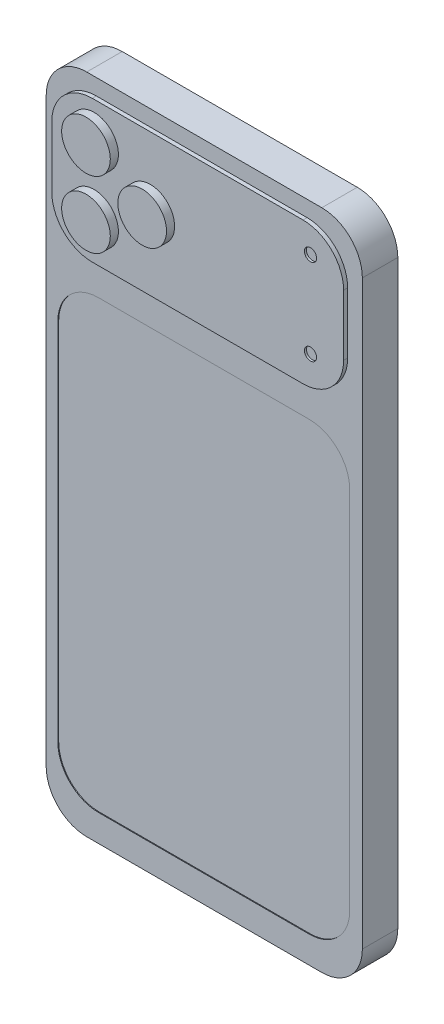
ISO-10303-21;
HEADER;
FILE_DESCRIPTION(('STEP AP214'),'2;1');
FILE_NAME('part.step','',(''),(''),'','','');
FILE_SCHEMA(('AUTOMOTIVE_DESIGN { 1 0 10303 214 1 1 1 1 }'));
ENDSEC;
DATA;
#1=APPLICATION_CONTEXT('core data for automotive mechanical design processes');
#2=APPLICATION_PROTOCOL_DEFINITION('international standard','automotive_design',2000,#1);
#3=PRODUCT_CONTEXT('',#1,'mechanical');
#4=PRODUCT('Part','Part','',(#3));
#5=PRODUCT_RELATED_PRODUCT_CATEGORY('part','',(#4));
#6=PRODUCT_DEFINITION_FORMATION('','',#4);
#7=PRODUCT_DEFINITION_CONTEXT('part definition',#1,'design');
#8=PRODUCT_DEFINITION('design','',#6,#7);
#9=PRODUCT_DEFINITION_SHAPE('','',#8);
#10=(LENGTH_UNIT() NAMED_UNIT(*) SI_UNIT(.MILLI.,.METRE.));
#11=(NAMED_UNIT(*) PLANE_ANGLE_UNIT() SI_UNIT($,.RADIAN.));
#12=(NAMED_UNIT(*) SI_UNIT($,.STERADIAN.) SOLID_ANGLE_UNIT());
#13=UNCERTAINTY_MEASURE_WITH_UNIT(LENGTH_MEASURE(1.E-05),#10,'distance_accuracy_value','');
#14=(GEOMETRIC_REPRESENTATION_CONTEXT(3) GLOBAL_UNCERTAINTY_ASSIGNED_CONTEXT((#13)) GLOBAL_UNIT_ASSIGNED_CONTEXT((#10,
#11,#12)) REPRESENTATION_CONTEXT('',''));
#15=CARTESIAN_POINT('',(0.,0.,0.));
#16=DIRECTION('',(0.,0.,1.));
#17=DIRECTION('',(1.,0.,0.));
#18=AXIS2_PLACEMENT_3D('',#15,#16,#17);
#19=CARTESIAN_POINT('',(68.,10.,8.75));
#20=DIRECTION('',(0.,0.,1.));
#21=DIRECTION('',(1.,0.,0.));
#22=AXIS2_PLACEMENT_3D('',#19,#20,#21);
#23=PLANE('',#22);
#24=CARTESIAN_POINT('',(12.8879630427938,106.636129808757,8.75));
#25=DIRECTION('',(0.,0.,1.));
#26=DIRECTION('',(1.,0.,0.));
#27=AXIS2_PLACEMENT_3D('',#24,#25,#26);
#28=CIRCLE('',#27,10.);
#29=CARTESIAN_POINT('',(12.8879630427938,116.636129808757,8.75));
#30=VERTEX_POINT('',#29);
#31=CARTESIAN_POINT('',(2.88796304279382,106.636129808757,8.75));
#32=VERTEX_POINT('',#31);
#33=EDGE_CURVE('E60',#30,#32,#28,.T.);
#34=ORIENTED_EDGE('',*,*,#33,.F.);
#35=DIRECTION('',(1.,0.,0.));
#36=VECTOR('',#35,1.);
#37=CARTESIAN_POINT('',(12.8879630427938,116.636129808757,8.75));
#38=LINE('',#37,#36);
#39=CARTESIAN_POINT('',(64.8879630427938,116.636129808757,8.75));
#40=VERTEX_POINT('',#39);
#41=EDGE_CURVE('E230',#30,#40,#38,.T.);
#42=ORIENTED_EDGE('',*,*,#41,.T.);
#43=CARTESIAN_POINT('',(64.8879630427938,106.636129808757,8.75));
#44=DIRECTION('',(0.,0.,-1.));
#45=DIRECTION('',(-1.,0.,0.));
#46=AXIS2_PLACEMENT_3D('',#43,#44,#45);
#47=CIRCLE('',#46,10.);
#48=CARTESIAN_POINT('',(74.8879630427938,106.636129808757,8.75));
#49=VERTEX_POINT('',#48);
#50=EDGE_CURVE('E234',#40,#49,#47,.T.);
#51=ORIENTED_EDGE('',*,*,#50,.T.);
#52=DIRECTION('',(0.,-1.,0.));
#53=VECTOR('',#52,1.);
#54=CARTESIAN_POINT('',(74.8879630427938,106.636129808757,8.75));
#55=LINE('',#54,#53);
#56=CARTESIAN_POINT('',(74.8879630427938,16.6361298087572,8.75));
#57=VERTEX_POINT('',#56);
#58=EDGE_CURVE('E272',#49,#57,#55,.T.);
#59=ORIENTED_EDGE('',*,*,#58,.T.);
#60=CARTESIAN_POINT('',(64.8879630427938,16.6361298087572,8.75));
#61=DIRECTION('',(0.,0.,1.));
#62=DIRECTION('',(1.,0.,0.));
#63=AXIS2_PLACEMENT_3D('',#60,#61,#62);
#64=CIRCLE('',#63,10.);
#65=CARTESIAN_POINT('',(64.8879630427938,6.63612980875716,8.75));
#66=VERTEX_POINT('',#65);
#67=EDGE_CURVE('E268',#66,#57,#64,.T.);
#68=ORIENTED_EDGE('',*,*,#67,.F.);
#69=DIRECTION('',(1.,0.,0.));
#70=VECTOR('',#69,1.);
#71=CARTESIAN_POINT('',(12.8879630427938,6.63612980875716,8.75));
#72=LINE('',#71,#70);
#73=CARTESIAN_POINT('',(12.8879630427938,6.63612980875716,8.75));
#74=VERTEX_POINT('',#73);
#75=EDGE_CURVE('E264',#74,#66,#72,.T.);
#76=ORIENTED_EDGE('',*,*,#75,.F.);
#77=CARTESIAN_POINT('',(12.8879630427938,16.6361298087572,8.75));
#78=DIRECTION('',(0.,0.,1.));
#79=DIRECTION('',(1.,0.,0.));
#80=AXIS2_PLACEMENT_3D('',#77,#78,#79);
#81=CIRCLE('',#80,10.);
#82=CARTESIAN_POINT('',(2.88796304279383,16.6361298087572,8.75));
#83=VERTEX_POINT('',#82);
#84=EDGE_CURVE('E260',#83,#74,#81,.T.);
#85=ORIENTED_EDGE('',*,*,#84,.F.);
#86=DIRECTION('',(0.,-1.,0.));
#87=VECTOR('',#86,1.);
#88=CARTESIAN_POINT('',(2.88796304279382,106.636129808757,8.75));
#89=LINE('',#88,#87);
#90=EDGE_CURVE('E257',#32,#83,#89,.T.);
#91=ORIENTED_EDGE('',*,*,#90,.F.);
#92=EDGE_LOOP('',(#34,#42,#51,#59,#68,#76,#85,#91));
#93=FACE_BOUND('',#92,.T.);
#94=CARTESIAN_POINT('',(68.,10.,8.75));
#95=DIRECTION('',(0.,0.,1.));
#96=DIRECTION('',(1.,0.,0.));
#97=AXIS2_PLACEMENT_3D('',#94,#95,#96);
#98=CIRCLE('',#97,10.);
#99=CARTESIAN_POINT('',(67.9999999999999,0.,8.75));
#100=VERTEX_POINT('',#99);
#101=CARTESIAN_POINT('',(78.,10.0000000000001,8.75));
#102=VERTEX_POINT('',#101);
#103=EDGE_CURVE('E419',#100,#102,#98,.T.);
#104=ORIENTED_EDGE('',*,*,#103,.T.);
#105=DIRECTION('',(0.,1.,0.));
#106=VECTOR('',#105,1.);
#107=CARTESIAN_POINT('',(78.,10.0000000000001,8.75));
#108=LINE('',#107,#106);
#109=CARTESIAN_POINT('',(78.,153.4,8.75));
#110=VERTEX_POINT('',#109);
#111=EDGE_CURVE('E423',#102,#110,#108,.T.);
#112=ORIENTED_EDGE('',*,*,#111,.T.);
#113=CARTESIAN_POINT('',(68.,153.4,8.75));
#114=DIRECTION('',(0.,0.,1.));
#115=DIRECTION('',(-1.,0.,0.));
#116=AXIS2_PLACEMENT_3D('',#113,#114,#115);
#117=CIRCLE('',#116,10.);
#118=CARTESIAN_POINT('',(67.9999999999999,163.4,8.75));
#119=VERTEX_POINT('',#118);
#120=EDGE_CURVE('E427',#110,#119,#117,.T.);
#121=ORIENTED_EDGE('',*,*,#120,.T.);
#122=DIRECTION('',(-1.,0.,0.));
#123=VECTOR('',#122,1.);
#124=CARTESIAN_POINT('',(10.0000000000001,163.4,8.75));
#125=LINE('',#124,#123);
#126=CARTESIAN_POINT('',(10.0000000000001,163.4,8.75));
#127=VERTEX_POINT('',#126);
#128=EDGE_CURVE('E430',#119,#127,#125,.T.);
#129=ORIENTED_EDGE('',*,*,#128,.T.);
#130=CARTESIAN_POINT('',(10.,153.4,8.75));
#131=DIRECTION('',(0.,0.,1.));
#132=DIRECTION('',(-1.,0.,0.));
#133=AXIS2_PLACEMENT_3D('',#130,#131,#132);
#134=CIRCLE('',#133,10.);
#135=CARTESIAN_POINT('',(0.,153.4,8.75));
#136=VERTEX_POINT('',#135);
#137=EDGE_CURVE('E433',#127,#136,#134,.T.);
#138=ORIENTED_EDGE('',*,*,#137,.T.);
#139=DIRECTION('',(0.,-1.,0.));
#140=VECTOR('',#139,1.);
#141=CARTESIAN_POINT('',(0.,10.0000000000001,8.75));
#142=LINE('',#141,#140);
#143=CARTESIAN_POINT('',(0.,10.,8.75));
#144=VERTEX_POINT('',#143);
#145=EDGE_CURVE('E436',#136,#144,#142,.T.);
#146=ORIENTED_EDGE('',*,*,#145,.T.);
#147=CARTESIAN_POINT('',(10.,10.,8.75));
#148=DIRECTION('',(0.,0.,1.));
#149=DIRECTION('',(-1.,0.,0.));
#150=AXIS2_PLACEMENT_3D('',#147,#148,#149);
#151=CIRCLE('',#150,10.);
#152=CARTESIAN_POINT('',(10.0000000000001,0.,8.75));
#153=VERTEX_POINT('',#152);
#154=EDGE_CURVE('E439',#144,#153,#151,.T.);
#155=ORIENTED_EDGE('',*,*,#154,.T.);
#156=DIRECTION('',(1.,0.,0.));
#157=VECTOR('',#156,1.);
#158=CARTESIAN_POINT('',(10.0000000000001,0.,8.75));
#159=LINE('',#158,#157);
#160=EDGE_CURVE('E442',#153,#100,#159,.T.);
#161=ORIENTED_EDGE('',*,*,#160,.T.);
#162=EDGE_LOOP('',(#104,#112,#121,#129,#138,#146,#155,#161));
#163=FACE_BOUND('',#162,.T.);
#164=DIRECTION('',(0.,1.,0.));
#165=VECTOR('',#164,1.);
#166=CARTESIAN_POINT('',(74.3758840116157,149.465412192978,8.75));
#167=LINE('',#166,#165);
#168=CARTESIAN_POINT('',(74.3758840116157,134.465412192977,8.75));
#169=VERTEX_POINT('',#168);
#170=CARTESIAN_POINT('',(74.3758840116157,149.465412192978,8.75));
#171=VERTEX_POINT('',#170);
#172=EDGE_CURVE('E370',#169,#171,#167,.T.);
#173=ORIENTED_EDGE('',*,*,#172,.F.);
#174=CARTESIAN_POINT('',(64.3758840116157,134.465412192977,8.75));
#175=DIRECTION('',(0.,0.,1.));
#176=DIRECTION('',(1.,0.,0.));
#177=AXIS2_PLACEMENT_3D('',#174,#175,#176);
#178=CIRCLE('',#177,10.);
#179=CARTESIAN_POINT('',(64.3758840116157,124.465412192977,8.75));
#180=VERTEX_POINT('',#179);
#181=EDGE_CURVE('E336',#180,#169,#178,.T.);
#182=ORIENTED_EDGE('',*,*,#181,.F.);
#183=DIRECTION('',(1.,0.,0.));
#184=VECTOR('',#183,1.);
#185=CARTESIAN_POINT('',(12.3758840116157,124.465412192977,8.75));
#186=LINE('',#185,#184);
#187=CARTESIAN_POINT('',(12.3758840116157,124.465412192977,8.75));
#188=VERTEX_POINT('',#187);
#189=EDGE_CURVE('E345',#188,#180,#186,.T.);
#190=ORIENTED_EDGE('',*,*,#189,.F.);
#191=CARTESIAN_POINT('',(12.3758840116157,134.465412192977,8.75));
#192=DIRECTION('',(0.,0.,1.));
#193=DIRECTION('',(1.,0.,0.));
#194=AXIS2_PLACEMENT_3D('',#191,#192,#193);
#195=CIRCLE('',#194,10.);
#196=CARTESIAN_POINT('',(2.37588401161573,134.465412192977,8.75));
#197=VERTEX_POINT('',#196);
#198=EDGE_CURVE('E385',#197,#188,#195,.T.);
#199=ORIENTED_EDGE('',*,*,#198,.F.);
#200=DIRECTION('',(0.,-1.,0.));
#201=VECTOR('',#200,1.);
#202=CARTESIAN_POINT('',(2.37588401161573,149.465412192978,8.75));
#203=LINE('',#202,#201);
#204=CARTESIAN_POINT('',(2.37588401161573,149.465412192978,8.75));
#205=VERTEX_POINT('',#204);
#206=EDGE_CURVE('E382',#205,#197,#203,.T.);
#207=ORIENTED_EDGE('',*,*,#206,.F.);
#208=CARTESIAN_POINT('',(12.3758840116157,149.465412192978,8.75));
#209=DIRECTION('',(0.,0.,1.));
#210=DIRECTION('',(1.,0.,0.));
#211=AXIS2_PLACEMENT_3D('',#208,#209,#210);
#212=CIRCLE('',#211,10.);
#213=CARTESIAN_POINT('',(12.3758840116157,159.465412192978,8.75));
#214=VERTEX_POINT('',#213);
#215=EDGE_CURVE('E379',#214,#205,#212,.T.);
#216=ORIENTED_EDGE('',*,*,#215,.F.);
#217=DIRECTION('',(-1.,0.,0.));
#218=VECTOR('',#217,1.);
#219=CARTESIAN_POINT('',(12.3758840116157,159.465412192978,8.75));
#220=LINE('',#219,#218);
#221=CARTESIAN_POINT('',(64.3758840116157,159.465412192978,8.75));
#222=VERTEX_POINT('',#221);
#223=EDGE_CURVE('E376',#222,#214,#220,.T.);
#224=ORIENTED_EDGE('',*,*,#223,.F.);
#225=CARTESIAN_POINT('',(64.3758840116157,149.465412192978,8.75));
#226=DIRECTION('',(0.,0.,1.));
#227=DIRECTION('',(-1.,0.,0.));
#228=AXIS2_PLACEMENT_3D('',#225,#226,#227);
#229=CIRCLE('',#228,10.);
#230=EDGE_CURVE('E373',#171,#222,#229,.T.);
#231=ORIENTED_EDGE('',*,*,#230,.F.);
#232=EDGE_LOOP('',(#173,#182,#190,#199,#207,#216,#224,#231));
#233=FACE_BOUND('',#232,.T.);
#234=ADVANCED_FACE('F44',(#93,#163,#233),#23,.T.);
#235=CARTESIAN_POINT('',(68.,10.,8.75));
#236=DIRECTION('',(0.,0.,-1.));
#237=DIRECTION('',(-1.,0.,0.));
#238=AXIS2_PLACEMENT_3D('',#235,#236,#237);
#239=CYLINDRICAL_SURFACE('',#238,10.);
#240=CARTESIAN_POINT('',(68.,10.,0.));
#241=DIRECTION('',(0.,0.,1.));
#242=DIRECTION('',(1.,0.,0.));
#243=AXIS2_PLACEMENT_3D('',#240,#241,#242);
#244=CIRCLE('',#243,10.);
#245=CARTESIAN_POINT('',(67.9999999999999,0.,0.));
#246=VERTEX_POINT('',#245);
#247=CARTESIAN_POINT('',(78.,10.0000000000001,0.));
#248=VERTEX_POINT('',#247);
#249=EDGE_CURVE('E418',#246,#248,#244,.T.);
#250=ORIENTED_EDGE('',*,*,#249,.T.);
#251=DIRECTION('',(0.,0.,-1.));
#252=VECTOR('',#251,1.);
#253=CARTESIAN_POINT('',(78.,10.0000000000001,8.75));
#254=LINE('',#253,#252);
#255=EDGE_CURVE('E11',#102,#248,#254,.T.);
#256=ORIENTED_EDGE('',*,*,#255,.F.);
#257=ORIENTED_EDGE('',*,*,#103,.F.);
#258=DIRECTION('',(0.,0.,-1.));
#259=VECTOR('',#258,1.);
#260=CARTESIAN_POINT('',(67.9999999999999,0.,8.75));
#261=LINE('',#260,#259);
#262=EDGE_CURVE('E445',#100,#246,#261,.T.);
#263=ORIENTED_EDGE('',*,*,#262,.T.);
#264=EDGE_LOOP('',(#250,#256,#257,#263));
#265=FACE_BOUND('',#264,.T.);
#266=ADVANCED_FACE('F46',(#265),#239,.T.);
#267=CARTESIAN_POINT('',(78.,10.0000000000001,8.75));
#268=DIRECTION('',(-1.,0.,0.));
#269=DIRECTION('',(0.,0.,1.));
#270=AXIS2_PLACEMENT_3D('',#267,#268,#269);
#271=PLANE('',#270);
#272=DIRECTION('',(0.,1.,0.));
#273=VECTOR('',#272,1.);
#274=CARTESIAN_POINT('',(78.,10.0000000000001,0.));
#275=LINE('',#274,#273);
#276=CARTESIAN_POINT('',(78.,153.4,0.));
#277=VERTEX_POINT('',#276);
#278=EDGE_CURVE('E449',#248,#277,#275,.T.);
#279=ORIENTED_EDGE('',*,*,#278,.T.);
#280=DIRECTION('',(0.,0.,-1.));
#281=VECTOR('',#280,1.);
#282=CARTESIAN_POINT('',(78.,153.4,8.75));
#283=LINE('',#282,#281);
#284=EDGE_CURVE('E53',#110,#277,#283,.T.);
#285=ORIENTED_EDGE('',*,*,#284,.F.);
#286=ORIENTED_EDGE('',*,*,#111,.F.);
#287=ORIENTED_EDGE('',*,*,#255,.T.);
#288=EDGE_LOOP('',(#279,#285,#286,#287));
#289=FACE_BOUND('',#288,.T.);
#290=ADVANCED_FACE('F520',(#289),#271,.F.);
#291=CARTESIAN_POINT('',(68.,153.4,8.75));
#292=DIRECTION('',(0.,0.,-1.));
#293=DIRECTION('',(-1.,0.,0.));
#294=AXIS2_PLACEMENT_3D('',#291,#292,#293);
#295=CYLINDRICAL_SURFACE('',#294,10.);
#296=CARTESIAN_POINT('',(68.,153.4,0.));
#297=DIRECTION('',(0.,0.,1.));
#298=DIRECTION('',(-1.,0.,0.));
#299=AXIS2_PLACEMENT_3D('',#296,#297,#298);
#300=CIRCLE('',#299,10.);
#301=CARTESIAN_POINT('',(67.9999999999999,163.4,0.));
#302=VERTEX_POINT('',#301);
#303=EDGE_CURVE('E452',#277,#302,#300,.T.);
#304=ORIENTED_EDGE('',*,*,#303,.T.);
#305=DIRECTION('',(0.,0.,-1.));
#306=VECTOR('',#305,1.);
#307=CARTESIAN_POINT('',(67.9999999999999,163.4,8.75));
#308=LINE('',#307,#306);
#309=EDGE_CURVE('E488',#119,#302,#308,.T.);
#310=ORIENTED_EDGE('',*,*,#309,.F.);
#311=ORIENTED_EDGE('',*,*,#120,.F.);
#312=ORIENTED_EDGE('',*,*,#284,.T.);
#313=EDGE_LOOP('',(#304,#310,#311,#312));
#314=FACE_BOUND('',#313,.T.);
#315=ADVANCED_FACE('F497',(#314),#295,.T.);
#316=CARTESIAN_POINT('',(10.0000000000001,163.4,8.75));
#317=DIRECTION('',(0.,-1.,0.));
#318=DIRECTION('',(0.,0.,-1.));
#319=AXIS2_PLACEMENT_3D('',#316,#317,#318);
#320=PLANE('',#319);
#321=DIRECTION('',(-1.,0.,0.));
#322=VECTOR('',#321,1.);
#323=CARTESIAN_POINT('',(10.0000000000001,163.4,0.));
#324=LINE('',#323,#322);
#325=CARTESIAN_POINT('',(10.0000000000001,163.4,0.));
#326=VERTEX_POINT('',#325);
#327=EDGE_CURVE('E455',#302,#326,#324,.T.);
#328=ORIENTED_EDGE('',*,*,#327,.T.);
#329=DIRECTION('',(0.,0.,-1.));
#330=VECTOR('',#329,1.);
#331=CARTESIAN_POINT('',(10.0000000000001,163.4,8.75));
#332=LINE('',#331,#330);
#333=EDGE_CURVE('E484',#127,#326,#332,.T.);
#334=ORIENTED_EDGE('',*,*,#333,.F.);
#335=ORIENTED_EDGE('',*,*,#128,.F.);
#336=ORIENTED_EDGE('',*,*,#309,.T.);
#337=EDGE_LOOP('',(#328,#334,#335,#336));
#338=FACE_BOUND('',#337,.T.);
#339=ADVANCED_FACE('F508',(#338),#320,.F.);
#340=CARTESIAN_POINT('',(10.,153.4,8.75));
#341=DIRECTION('',(0.,0.,-1.));
#342=DIRECTION('',(-1.,0.,0.));
#343=AXIS2_PLACEMENT_3D('',#340,#341,#342);
#344=CYLINDRICAL_SURFACE('',#343,10.);
#345=CARTESIAN_POINT('',(10.,153.4,0.));
#346=DIRECTION('',(0.,0.,1.));
#347=DIRECTION('',(-1.,0.,0.));
#348=AXIS2_PLACEMENT_3D('',#345,#346,#347);
#349=CIRCLE('',#348,10.);
#350=CARTESIAN_POINT('',(0.,153.4,0.));
#351=VERTEX_POINT('',#350);
#352=EDGE_CURVE('E458',#326,#351,#349,.T.);
#353=ORIENTED_EDGE('',*,*,#352,.T.);
#354=DIRECTION('',(0.,0.,-1.));
#355=VECTOR('',#354,1.);
#356=CARTESIAN_POINT('',(0.,153.4,8.75));
#357=LINE('',#356,#355);
#358=EDGE_CURVE('E480',#136,#351,#357,.T.);
#359=ORIENTED_EDGE('',*,*,#358,.F.);
#360=ORIENTED_EDGE('',*,*,#137,.F.);
#361=ORIENTED_EDGE('',*,*,#333,.T.);
#362=EDGE_LOOP('',(#353,#359,#360,#361));
#363=FACE_BOUND('',#362,.T.);
#364=ADVANCED_FACE('F512',(#363),#344,.T.);
#365=CARTESIAN_POINT('',(0.,10.0000000000001,8.75));
#366=DIRECTION('',(1.,0.,0.));
#367=DIRECTION('',(0.,0.,-1.));
#368=AXIS2_PLACEMENT_3D('',#365,#366,#367);
#369=PLANE('',#368);
#370=DIRECTION('',(0.,-1.,0.));
#371=VECTOR('',#370,1.);
#372=CARTESIAN_POINT('',(0.,10.0000000000001,0.));
#373=LINE('',#372,#371);
#374=CARTESIAN_POINT('',(0.,10.,0.));
#375=VERTEX_POINT('',#374);
#376=EDGE_CURVE('E461',#351,#375,#373,.T.);
#377=ORIENTED_EDGE('',*,*,#376,.T.);
#378=DIRECTION('',(0.,0.,-1.));
#379=VECTOR('',#378,1.);
#380=CARTESIAN_POINT('',(0.,10.,8.75));
#381=LINE('',#380,#379);
#382=EDGE_CURVE('E476',#144,#375,#381,.T.);
#383=ORIENTED_EDGE('',*,*,#382,.F.);
#384=ORIENTED_EDGE('',*,*,#145,.F.);
#385=ORIENTED_EDGE('',*,*,#358,.T.);
#386=EDGE_LOOP('',(#377,#383,#384,#385));
#387=FACE_BOUND('',#386,.T.);
#388=ADVANCED_FACE('F533',(#387),#369,.F.);
#389=CARTESIAN_POINT('',(10.,10.,8.75));
#390=DIRECTION('',(0.,0.,-1.));
#391=DIRECTION('',(-1.,0.,0.));
#392=AXIS2_PLACEMENT_3D('',#389,#390,#391);
#393=CYLINDRICAL_SURFACE('',#392,10.);
#394=CARTESIAN_POINT('',(10.,10.,0.));
#395=DIRECTION('',(0.,0.,1.));
#396=DIRECTION('',(-1.,0.,0.));
#397=AXIS2_PLACEMENT_3D('',#394,#395,#396);
#398=CIRCLE('',#397,10.);
#399=CARTESIAN_POINT('',(10.0000000000001,0.,0.));
#400=VERTEX_POINT('',#399);
#401=EDGE_CURVE('E464',#375,#400,#398,.T.);
#402=ORIENTED_EDGE('',*,*,#401,.T.);
#403=DIRECTION('',(0.,0.,-1.));
#404=VECTOR('',#403,1.);
#405=CARTESIAN_POINT('',(10.0000000000001,0.,8.75));
#406=LINE('',#405,#404);
#407=EDGE_CURVE('E472',#153,#400,#406,.T.);
#408=ORIENTED_EDGE('',*,*,#407,.F.);
#409=ORIENTED_EDGE('',*,*,#154,.F.);
#410=ORIENTED_EDGE('',*,*,#382,.T.);
#411=EDGE_LOOP('',(#402,#408,#409,#410));
#412=FACE_BOUND('',#411,.T.);
#413=ADVANCED_FACE('F531',(#412),#393,.T.);
#414=CARTESIAN_POINT('',(10.0000000000001,0.,8.75));
#415=DIRECTION('',(0.,1.,0.));
#416=DIRECTION('',(0.,0.,1.));
#417=AXIS2_PLACEMENT_3D('',#414,#415,#416);
#418=PLANE('',#417);
#419=DIRECTION('',(1.,0.,0.));
#420=VECTOR('',#419,1.);
#421=CARTESIAN_POINT('',(10.0000000000001,0.,0.));
#422=LINE('',#421,#420);
#423=EDGE_CURVE('E424',#400,#246,#422,.T.);
#424=ORIENTED_EDGE('',*,*,#423,.T.);
#425=ORIENTED_EDGE('',*,*,#262,.F.);
#426=ORIENTED_EDGE('',*,*,#160,.F.);
#427=ORIENTED_EDGE('',*,*,#407,.T.);
#428=EDGE_LOOP('',(#424,#425,#426,#427));
#429=FACE_BOUND('',#428,.T.);
#430=ADVANCED_FACE('F526',(#429),#418,.F.);
#431=CARTESIAN_POINT('',(68.,10.,0.));
#432=DIRECTION('',(0.,0.,1.));
#433=DIRECTION('',(1.,0.,0.));
#434=AXIS2_PLACEMENT_3D('',#431,#432,#433);
#435=PLANE('',#434);
#436=ORIENTED_EDGE('',*,*,#249,.F.);
#437=ORIENTED_EDGE('',*,*,#423,.F.);
#438=ORIENTED_EDGE('',*,*,#401,.F.);
#439=ORIENTED_EDGE('',*,*,#376,.F.);
#440=ORIENTED_EDGE('',*,*,#352,.F.);
#441=ORIENTED_EDGE('',*,*,#327,.F.);
#442=ORIENTED_EDGE('',*,*,#303,.F.);
#443=ORIENTED_EDGE('',*,*,#278,.F.);
#444=EDGE_LOOP('',(#436,#437,#438,#439,#440,#441,#442,#443));
#445=FACE_BOUND('',#444,.T.);
#446=ADVANCED_FACE('F503',(#445),#435,.F.);
#447=CARTESIAN_POINT('',(64.3758840116157,134.465412192977,9.75));
#448=DIRECTION('',(0.,0.,-1.));
#449=DIRECTION('',(-1.,0.,0.));
#450=AXIS2_PLACEMENT_3D('',#447,#448,#449);
#451=CYLINDRICAL_SURFACE('',#450,10.);
#452=ORIENTED_EDGE('',*,*,#181,.T.);
#453=DIRECTION('',(0.,0.,-1.));
#454=VECTOR('',#453,1.);
#455=CARTESIAN_POINT('',(74.3758840116157,134.465412192977,9.75));
#456=LINE('',#455,#454);
#457=CARTESIAN_POINT('',(74.3758840116157,134.465412192977,9.75));
#458=VERTEX_POINT('',#457);
#459=EDGE_CURVE('E415',#458,#169,#456,.T.);
#460=ORIENTED_EDGE('',*,*,#459,.F.);
#461=CARTESIAN_POINT('',(64.3758840116157,134.465412192977,9.75));
#462=DIRECTION('',(0.,0.,1.));
#463=DIRECTION('',(1.,0.,0.));
#464=AXIS2_PLACEMENT_3D('',#461,#462,#463);
#465=CIRCLE('',#464,10.);
#466=CARTESIAN_POINT('',(64.3758840116157,124.465412192977,9.75));
#467=VERTEX_POINT('',#466);
#468=EDGE_CURVE('E340',#467,#458,#465,.T.);
#469=ORIENTED_EDGE('',*,*,#468,.F.);
#470=DIRECTION('',(0.,0.,-1.));
#471=VECTOR('',#470,1.);
#472=CARTESIAN_POINT('',(64.3758840116157,124.465412192977,9.75));
#473=LINE('',#472,#471);
#474=EDGE_CURVE('E366',#467,#180,#473,.T.);
#475=ORIENTED_EDGE('',*,*,#474,.T.);
#476=EDGE_LOOP('',(#452,#460,#469,#475));
#477=FACE_BOUND('',#476,.T.);
#478=ADVANCED_FACE('F550',(#477),#451,.T.);
#479=CARTESIAN_POINT('',(74.3758840116157,149.465412192978,9.75));
#480=DIRECTION('',(-1.,0.,0.));
#481=DIRECTION('',(0.,-1.,0.));
#482=AXIS2_PLACEMENT_3D('',#479,#480,#481);
#483=PLANE('',#482);
#484=ORIENTED_EDGE('',*,*,#172,.T.);
#485=DIRECTION('',(0.,0.,-1.));
#486=VECTOR('',#485,1.);
#487=CARTESIAN_POINT('',(74.3758840116157,149.465412192978,9.75));
#488=LINE('',#487,#486);
#489=CARTESIAN_POINT('',(74.3758840116157,149.465412192978,9.75));
#490=VERTEX_POINT('',#489);
#491=EDGE_CURVE('E411',#490,#171,#488,.T.);
#492=ORIENTED_EDGE('',*,*,#491,.F.);
#493=DIRECTION('',(0.,1.,0.));
#494=VECTOR('',#493,1.);
#495=CARTESIAN_POINT('',(74.3758840116157,149.465412192978,9.75));
#496=LINE('',#495,#494);
#497=EDGE_CURVE('E344',#458,#490,#496,.T.);
#498=ORIENTED_EDGE('',*,*,#497,.F.);
#499=ORIENTED_EDGE('',*,*,#459,.T.);
#500=EDGE_LOOP('',(#484,#492,#498,#499));
#501=FACE_BOUND('',#500,.T.);
#502=ADVANCED_FACE('F569',(#501),#483,.F.);
#503=CARTESIAN_POINT('',(64.3758840116157,149.465412192978,9.75));
#504=DIRECTION('',(0.,0.,-1.));
#505=DIRECTION('',(-1.,0.,0.));
#506=AXIS2_PLACEMENT_3D('',#503,#504,#505);
#507=CYLINDRICAL_SURFACE('',#506,10.);
#508=ORIENTED_EDGE('',*,*,#230,.T.);
#509=DIRECTION('',(0.,0.,-1.));
#510=VECTOR('',#509,1.);
#511=CARTESIAN_POINT('',(64.3758840116157,159.465412192978,9.75));
#512=LINE('',#511,#510);
#513=CARTESIAN_POINT('',(64.3758840116157,159.465412192978,9.75));
#514=VERTEX_POINT('',#513);
#515=EDGE_CURVE('E407',#514,#222,#512,.T.);
#516=ORIENTED_EDGE('',*,*,#515,.F.);
#517=CARTESIAN_POINT('',(64.3758840116157,149.465412192978,9.75));
#518=DIRECTION('',(0.,0.,1.));
#519=DIRECTION('',(-1.,0.,0.));
#520=AXIS2_PLACEMENT_3D('',#517,#518,#519);
#521=CIRCLE('',#520,10.);
#522=EDGE_CURVE('E348',#490,#514,#521,.T.);
#523=ORIENTED_EDGE('',*,*,#522,.F.);
#524=ORIENTED_EDGE('',*,*,#491,.T.);
#525=EDGE_LOOP('',(#508,#516,#523,#524));
#526=FACE_BOUND('',#525,.T.);
#527=ADVANCED_FACE('F576',(#526),#507,.T.);
#528=CARTESIAN_POINT('',(12.3758840116157,159.465412192978,9.75));
#529=DIRECTION('',(0.,-1.,0.));
#530=DIRECTION('',(0.,0.,-1.));
#531=AXIS2_PLACEMENT_3D('',#528,#529,#530);
#532=PLANE('',#531);
#533=ORIENTED_EDGE('',*,*,#223,.T.);
#534=DIRECTION('',(0.,0.,-1.));
#535=VECTOR('',#534,1.);
#536=CARTESIAN_POINT('',(12.3758840116157,159.465412192978,9.75));
#537=LINE('',#536,#535);
#538=CARTESIAN_POINT('',(12.3758840116157,159.465412192978,9.75));
#539=VERTEX_POINT('',#538);
#540=EDGE_CURVE('E403',#539,#214,#537,.T.);
#541=ORIENTED_EDGE('',*,*,#540,.F.);
#542=DIRECTION('',(-1.,0.,0.));
#543=VECTOR('',#542,1.);
#544=CARTESIAN_POINT('',(12.3758840116157,159.465412192978,9.75));
#545=LINE('',#544,#543);
#546=EDGE_CURVE('E351',#514,#539,#545,.T.);
#547=ORIENTED_EDGE('',*,*,#546,.F.);
#548=ORIENTED_EDGE('',*,*,#515,.T.);
#549=EDGE_LOOP('',(#533,#541,#547,#548));
#550=FACE_BOUND('',#549,.T.);
#551=ADVANCED_FACE('F583',(#550),#532,.F.);
#552=CARTESIAN_POINT('',(12.3758840116157,149.465412192978,9.75));
#553=DIRECTION('',(0.,0.,-1.));
#554=DIRECTION('',(-1.,0.,0.));
#555=AXIS2_PLACEMENT_3D('',#552,#553,#554);
#556=CYLINDRICAL_SURFACE('',#555,10.);
#557=ORIENTED_EDGE('',*,*,#215,.T.);
#558=DIRECTION('',(0.,0.,-1.));
#559=VECTOR('',#558,1.);
#560=CARTESIAN_POINT('',(2.37588401161573,149.465412192978,9.75));
#561=LINE('',#560,#559);
#562=CARTESIAN_POINT('',(2.37588401161573,149.465412192978,9.75));
#563=VERTEX_POINT('',#562);
#564=EDGE_CURVE('E399',#563,#205,#561,.T.);
#565=ORIENTED_EDGE('',*,*,#564,.F.);
#566=CARTESIAN_POINT('',(12.3758840116157,149.465412192978,9.75));
#567=DIRECTION('',(0.,0.,1.));
#568=DIRECTION('',(1.,0.,0.));
#569=AXIS2_PLACEMENT_3D('',#566,#567,#568);
#570=CIRCLE('',#569,10.);
#571=EDGE_CURVE('E354',#539,#563,#570,.T.);
#572=ORIENTED_EDGE('',*,*,#571,.F.);
#573=ORIENTED_EDGE('',*,*,#540,.T.);
#574=EDGE_LOOP('',(#557,#565,#572,#573));
#575=FACE_BOUND('',#574,.T.);
#576=ADVANCED_FACE('F591',(#575),#556,.T.);
#577=CARTESIAN_POINT('',(2.37588401161573,149.465412192978,9.75));
#578=DIRECTION('',(1.,0.,0.));
#579=DIRECTION('',(0.,1.,0.));
#580=AXIS2_PLACEMENT_3D('',#577,#578,#579);
#581=PLANE('',#580);
#582=ORIENTED_EDGE('',*,*,#206,.T.);
#583=DIRECTION('',(0.,0.,-1.));
#584=VECTOR('',#583,1.);
#585=CARTESIAN_POINT('',(2.37588401161573,134.465412192977,9.75));
#586=LINE('',#585,#584);
#587=CARTESIAN_POINT('',(2.37588401161573,134.465412192977,9.75));
#588=VERTEX_POINT('',#587);
#589=EDGE_CURVE('E395',#588,#197,#586,.T.);
#590=ORIENTED_EDGE('',*,*,#589,.F.);
#591=DIRECTION('',(0.,-1.,0.));
#592=VECTOR('',#591,1.);
#593=CARTESIAN_POINT('',(2.37588401161573,149.465412192978,9.75));
#594=LINE('',#593,#592);
#595=EDGE_CURVE('E357',#563,#588,#594,.T.);
#596=ORIENTED_EDGE('',*,*,#595,.F.);
#597=ORIENTED_EDGE('',*,*,#564,.T.);
#598=EDGE_LOOP('',(#582,#590,#596,#597));
#599=FACE_BOUND('',#598,.T.);
#600=ADVANCED_FACE('F599',(#599),#581,.F.);
#601=CARTESIAN_POINT('',(12.3758840116157,134.465412192977,9.75));
#602=DIRECTION('',(0.,0.,-1.));
#603=DIRECTION('',(-1.,0.,0.));
#604=AXIS2_PLACEMENT_3D('',#601,#602,#603);
#605=CYLINDRICAL_SURFACE('',#604,10.);
#606=ORIENTED_EDGE('',*,*,#198,.T.);
#607=DIRECTION('',(0.,0.,-1.));
#608=VECTOR('',#607,1.);
#609=CARTESIAN_POINT('',(12.3758840116157,124.465412192977,9.75));
#610=LINE('',#609,#608);
#611=CARTESIAN_POINT('',(12.3758840116157,124.465412192977,9.75));
#612=VERTEX_POINT('',#611);
#613=EDGE_CURVE('E68',#612,#188,#610,.T.);
#614=ORIENTED_EDGE('',*,*,#613,.F.);
#615=CARTESIAN_POINT('',(12.3758840116157,134.465412192977,9.75));
#616=DIRECTION('',(0.,0.,1.));
#617=DIRECTION('',(1.,0.,0.));
#618=AXIS2_PLACEMENT_3D('',#615,#616,#617);
#619=CIRCLE('',#618,10.);
#620=EDGE_CURVE('E360',#588,#612,#619,.T.);
#621=ORIENTED_EDGE('',*,*,#620,.F.);
#622=ORIENTED_EDGE('',*,*,#589,.T.);
#623=EDGE_LOOP('',(#606,#614,#621,#622));
#624=FACE_BOUND('',#623,.T.);
#625=ADVANCED_FACE('F607',(#624),#605,.T.);
#626=CARTESIAN_POINT('',(12.3758840116157,124.465412192977,9.75));
#627=DIRECTION('',(0.,1.,0.));
#628=DIRECTION('',(0.,0.,1.));
#629=AXIS2_PLACEMENT_3D('',#626,#627,#628);
#630=PLANE('',#629);
#631=ORIENTED_EDGE('',*,*,#189,.T.);
#632=ORIENTED_EDGE('',*,*,#474,.F.);
#633=DIRECTION('',(1.,0.,0.));
#634=VECTOR('',#633,1.);
#635=CARTESIAN_POINT('',(12.3758840116157,124.465412192977,9.75));
#636=LINE('',#635,#634);
#637=EDGE_CURVE('E363',#612,#467,#636,.T.);
#638=ORIENTED_EDGE('',*,*,#637,.F.);
#639=ORIENTED_EDGE('',*,*,#613,.T.);
#640=EDGE_LOOP('',(#631,#632,#638,#639));
#641=FACE_BOUND('',#640,.T.);
#642=ADVANCED_FACE('F615',(#641),#630,.F.);
#643=CARTESIAN_POINT('',(64.3758840116157,134.465412192977,9.75));
#644=DIRECTION('',(0.,0.,1.));
#645=DIRECTION('',(1.,0.,0.));
#646=AXIS2_PLACEMENT_3D('',#643,#644,#645);
#647=PLANE('',#646);
#648=CARTESIAN_POINT('',(66.209801176285,152.964938363884,9.75));
#649=DIRECTION('',(0.,0.,1.));
#650=DIRECTION('',(1.,0.,0.));
#651=AXIS2_PLACEMENT_3D('',#648,#649,#650);
#652=CIRCLE('',#651,1.5);
#653=CARTESIAN_POINT('',(67.709801176285,152.964938363884,9.75));
#654=VERTEX_POINT('',#653);
#655=EDGE_CURVE('E305',#654,#654,#652,.T.);
#656=ORIENTED_EDGE('',*,*,#655,.F.);
#657=EDGE_LOOP('',(#656));
#658=FACE_BOUND('',#657,.T.);
#659=CARTESIAN_POINT('',(66.209801176285,131.745411372872,9.75));
#660=DIRECTION('',(0.,0.,1.));
#661=DIRECTION('',(1.,0.,0.));
#662=AXIS2_PLACEMENT_3D('',#659,#660,#661);
#663=CIRCLE('',#662,1.5);
#664=CARTESIAN_POINT('',(67.709801176285,131.745411372872,9.75));
#665=VERTEX_POINT('',#664);
#666=EDGE_CURVE('E309',#665,#665,#663,.T.);
#667=ORIENTED_EDGE('',*,*,#666,.F.);
#668=EDGE_LOOP('',(#667));
#669=FACE_BOUND('',#668,.T.);
#670=CARTESIAN_POINT('',(12.8175794279992,134.217868615107,9.75));
#671=DIRECTION('',(0.,0.,1.));
#672=DIRECTION('',(1.,0.,0.));
#673=AXIS2_PLACEMENT_3D('',#670,#671,#672);
#674=CIRCLE('',#673,6.);
#675=CARTESIAN_POINT('',(18.8175794279992,134.217868615107,9.75));
#676=VERTEX_POINT('',#675);
#677=EDGE_CURVE('E316',#676,#676,#674,.T.);
#678=ORIENTED_EDGE('',*,*,#677,.F.);
#679=EDGE_LOOP('',(#678));
#680=FACE_BOUND('',#679,.T.);
#681=CARTESIAN_POINT('',(26.6806646030726,142.232464731947,9.75));
#682=DIRECTION('',(0.,0.,1.));
#683=DIRECTION('',(1.,0.,0.));
#684=AXIS2_PLACEMENT_3D('',#681,#682,#683);
#685=CIRCLE('',#684,6.);
#686=CARTESIAN_POINT('',(32.6806646030726,142.232464731947,9.75));
#687=VERTEX_POINT('',#686);
#688=EDGE_CURVE('E324',#687,#687,#685,.T.);
#689=ORIENTED_EDGE('',*,*,#688,.F.);
#690=EDGE_LOOP('',(#689));
#691=FACE_BOUND('',#690,.T.);
#692=CARTESIAN_POINT('',(12.8175794279992,150.680282260507,9.75));
#693=DIRECTION('',(0.,0.,1.));
#694=DIRECTION('',(1.,0.,0.));
#695=AXIS2_PLACEMENT_3D('',#692,#693,#694);
#696=CIRCLE('',#695,6.);
#697=CARTESIAN_POINT('',(18.8175794279992,150.680282260507,9.75));
#698=VERTEX_POINT('',#697);
#699=EDGE_CURVE('E328',#698,#698,#696,.T.);
#700=ORIENTED_EDGE('',*,*,#699,.F.);
#701=EDGE_LOOP('',(#700));
#702=FACE_BOUND('',#701,.T.);
#703=ORIENTED_EDGE('',*,*,#468,.T.);
#704=ORIENTED_EDGE('',*,*,#497,.T.);
#705=ORIENTED_EDGE('',*,*,#522,.T.);
#706=ORIENTED_EDGE('',*,*,#546,.T.);
#707=ORIENTED_EDGE('',*,*,#571,.T.);
#708=ORIENTED_EDGE('',*,*,#595,.T.);
#709=ORIENTED_EDGE('',*,*,#620,.T.);
#710=ORIENTED_EDGE('',*,*,#637,.T.);
#711=EDGE_LOOP('',(#703,#704,#705,#706,#707,#708,#709,#710));
#712=FACE_BOUND('',#711,.T.);
#713=ADVANCED_FACE('F623',(#658,#669,#680,#691,#702,#712),#647,.T.);
#714=CARTESIAN_POINT('',(12.8175794279992,150.680282260507,11.75));
#715=DIRECTION('',(0.,0.,-1.));
#716=DIRECTION('',(-1.,0.,0.));
#717=AXIS2_PLACEMENT_3D('',#714,#715,#716);
#718=CYLINDRICAL_SURFACE('',#717,6.);
#719=CARTESIAN_POINT('',(12.8175794279992,150.680282260507,11.75));
#720=DIRECTION('',(0.,0.,1.));
#721=DIRECTION('',(1.,0.,0.));
#722=AXIS2_PLACEMENT_3D('',#719,#720,#721);
#723=CIRCLE('',#722,6.);
#724=CARTESIAN_POINT('',(18.8175794279992,150.680282260507,11.75));
#725=VERTEX_POINT('',#724);
#726=EDGE_CURVE('E332',#725,#725,#723,.T.);
#727=ORIENTED_EDGE('',*,*,#726,.F.);
#728=EDGE_LOOP('',(#727));
#729=FACE_BOUND('',#728,.T.);
#730=ORIENTED_EDGE('',*,*,#699,.T.);
#731=EDGE_LOOP('',(#730));
#732=FACE_BOUND('',#731,.T.);
#733=ADVANCED_FACE('F630',(#729,#732),#718,.T.);
#734=CARTESIAN_POINT('',(12.8175794279992,150.680282260507,11.75));
#735=DIRECTION('',(0.,0.,1.));
#736=DIRECTION('',(1.,0.,0.));
#737=AXIS2_PLACEMENT_3D('',#734,#735,#736);
#738=PLANE('',#737);
#739=ORIENTED_EDGE('',*,*,#726,.T.);
#740=EDGE_LOOP('',(#739));
#741=FACE_BOUND('',#740,.T.);
#742=ADVANCED_FACE('F638',(#741),#738,.T.);
#743=CARTESIAN_POINT('',(26.6806646030726,142.232464731947,11.75));
#744=DIRECTION('',(0.,0.,-1.));
#745=DIRECTION('',(-1.,0.,0.));
#746=AXIS2_PLACEMENT_3D('',#743,#744,#745);
#747=CYLINDRICAL_SURFACE('',#746,6.);
#748=CARTESIAN_POINT('',(26.6806646030726,142.232464731947,11.75));
#749=DIRECTION('',(0.,0.,1.));
#750=DIRECTION('',(1.,0.,0.));
#751=AXIS2_PLACEMENT_3D('',#748,#749,#750);
#752=CIRCLE('',#751,6.);
#753=CARTESIAN_POINT('',(32.6806646030726,142.232464731947,11.75));
#754=VERTEX_POINT('',#753);
#755=EDGE_CURVE('E320',#754,#754,#752,.T.);
#756=ORIENTED_EDGE('',*,*,#755,.F.);
#757=EDGE_LOOP('',(#756));
#758=FACE_BOUND('',#757,.T.);
#759=ORIENTED_EDGE('',*,*,#688,.T.);
#760=EDGE_LOOP('',(#759));
#761=FACE_BOUND('',#760,.T.);
#762=ADVANCED_FACE('F646',(#758,#761),#747,.T.);
#763=CARTESIAN_POINT('',(26.6806646030726,142.232464731947,11.75));
#764=DIRECTION('',(0.,0.,1.));
#765=DIRECTION('',(1.,0.,0.));
#766=AXIS2_PLACEMENT_3D('',#763,#764,#765);
#767=PLANE('',#766);
#768=ORIENTED_EDGE('',*,*,#755,.T.);
#769=EDGE_LOOP('',(#768));
#770=FACE_BOUND('',#769,.T.);
#771=ADVANCED_FACE('F654',(#770),#767,.T.);
#772=CARTESIAN_POINT('',(12.8175794279992,134.217868615107,11.75));
#773=DIRECTION('',(0.,0.,-1.));
#774=DIRECTION('',(-1.,0.,0.));
#775=AXIS2_PLACEMENT_3D('',#772,#773,#774);
#776=CYLINDRICAL_SURFACE('',#775,6.);
#777=CARTESIAN_POINT('',(12.8175794279992,134.217868615107,11.75));
#778=DIRECTION('',(0.,0.,1.));
#779=DIRECTION('',(1.,0.,0.));
#780=AXIS2_PLACEMENT_3D('',#777,#778,#779);
#781=CIRCLE('',#780,6.);
#782=CARTESIAN_POINT('',(18.8175794279992,134.217868615107,11.75));
#783=VERTEX_POINT('',#782);
#784=EDGE_CURVE('E304',#783,#783,#781,.T.);
#785=ORIENTED_EDGE('',*,*,#784,.F.);
#786=EDGE_LOOP('',(#785));
#787=FACE_BOUND('',#786,.T.);
#788=ORIENTED_EDGE('',*,*,#677,.T.);
#789=EDGE_LOOP('',(#788));
#790=FACE_BOUND('',#789,.T.);
#791=ADVANCED_FACE('F662',(#787,#790),#776,.T.);
#792=CARTESIAN_POINT('',(12.8175794279992,134.217868615107,11.75));
#793=DIRECTION('',(0.,0.,1.));
#794=DIRECTION('',(1.,0.,0.));
#795=AXIS2_PLACEMENT_3D('',#792,#793,#794);
#796=PLANE('',#795);
#797=ORIENTED_EDGE('',*,*,#784,.T.);
#798=EDGE_LOOP('',(#797));
#799=FACE_BOUND('',#798,.T.);
#800=ADVANCED_FACE('F670',(#799),#796,.T.);
#801=CARTESIAN_POINT('',(66.209801176285,131.745411372872,9.25));
#802=DIRECTION('',(0.,0.,1.));
#803=DIRECTION('',(1.,0.,0.));
#804=AXIS2_PLACEMENT_3D('',#801,#802,#803);
#805=CYLINDRICAL_SURFACE('',#804,1.5);
#806=CARTESIAN_POINT('',(66.209801176285,131.745411372872,9.25));
#807=DIRECTION('',(0.,0.,1.));
#808=DIRECTION('',(1.,0.,0.));
#809=AXIS2_PLACEMENT_3D('',#806,#807,#808);
#810=CIRCLE('',#809,1.5);
#811=CARTESIAN_POINT('',(67.709801176285,131.745411372872,9.25));
#812=VERTEX_POINT('',#811);
#813=EDGE_CURVE('E282',#812,#812,#810,.T.);
#814=ORIENTED_EDGE('',*,*,#813,.F.);
#815=EDGE_LOOP('',(#814));
#816=FACE_BOUND('',#815,.T.);
#817=ORIENTED_EDGE('',*,*,#666,.T.);
#818=EDGE_LOOP('',(#817));
#819=FACE_BOUND('',#818,.T.);
#820=ADVANCED_FACE('F678',(#816,#819),#805,.F.);
#821=CARTESIAN_POINT('',(66.209801176285,131.745411372872,9.25));
#822=DIRECTION('',(0.,0.,1.));
#823=DIRECTION('',(1.,0.,0.));
#824=AXIS2_PLACEMENT_3D('',#821,#822,#823);
#825=PLANE('',#824);
#826=ORIENTED_EDGE('',*,*,#813,.T.);
#827=EDGE_LOOP('',(#826));
#828=FACE_BOUND('',#827,.T.);
#829=ADVANCED_FACE('F686',(#828),#825,.T.);
#830=CARTESIAN_POINT('',(66.209801176285,152.964938363884,9.25));
#831=DIRECTION('',(0.,0.,1.));
#832=DIRECTION('',(1.,0.,0.));
#833=AXIS2_PLACEMENT_3D('',#830,#831,#832);
#834=CYLINDRICAL_SURFACE('',#833,1.5);
#835=CARTESIAN_POINT('',(66.209801176285,152.964938363884,9.25));
#836=DIRECTION('',(0.,0.,1.));
#837=DIRECTION('',(1.,0.,0.));
#838=AXIS2_PLACEMENT_3D('',#835,#836,#837);
#839=CIRCLE('',#838,1.5);
#840=CARTESIAN_POINT('',(67.709801176285,152.964938363884,9.25));
#841=VERTEX_POINT('',#840);
#842=EDGE_CURVE('E300',#841,#841,#839,.T.);
#843=ORIENTED_EDGE('',*,*,#842,.F.);
#844=EDGE_LOOP('',(#843));
#845=FACE_BOUND('',#844,.T.);
#846=ORIENTED_EDGE('',*,*,#655,.T.);
#847=EDGE_LOOP('',(#846));
#848=FACE_BOUND('',#847,.T.);
#849=ADVANCED_FACE('F694',(#845,#848),#834,.F.);
#850=CARTESIAN_POINT('',(66.209801176285,152.964938363884,9.25));
#851=DIRECTION('',(0.,0.,1.));
#852=DIRECTION('',(1.,0.,0.));
#853=AXIS2_PLACEMENT_3D('',#850,#851,#852);
#854=PLANE('',#853);
#855=ORIENTED_EDGE('',*,*,#842,.T.);
#856=EDGE_LOOP('',(#855));
#857=FACE_BOUND('',#856,.T.);
#858=ADVANCED_FACE('F702',(#857),#854,.T.);
#859=CARTESIAN_POINT('',(12.8879630427938,106.636129808757,8.55));
#860=DIRECTION('',(0.,0.,1.));
#861=DIRECTION('',(1.,0.,0.));
#862=AXIS2_PLACEMENT_3D('',#859,#860,#861);
#863=CYLINDRICAL_SURFACE('',#862,10.);
#864=ORIENTED_EDGE('',*,*,#33,.T.);
#865=DIRECTION('',(0.,0.,1.));
#866=VECTOR('',#865,1.);
#867=CARTESIAN_POINT('',(2.88796304279382,106.636129808757,8.55));
#868=LINE('',#867,#866);
#869=CARTESIAN_POINT('',(2.88796304279382,106.636129808757,8.55));
#870=VERTEX_POINT('',#869);
#871=EDGE_CURVE('E205',#870,#32,#868,.T.);
#872=ORIENTED_EDGE('',*,*,#871,.F.);
#873=CARTESIAN_POINT('',(12.8879630427938,106.636129808757,8.55));
#874=DIRECTION('',(0.,0.,1.));
#875=DIRECTION('',(1.,0.,0.));
#876=AXIS2_PLACEMENT_3D('',#873,#874,#875);
#877=CIRCLE('',#876,10.);
#878=CARTESIAN_POINT('',(12.8879630427938,116.636129808757,8.55));
#879=VERTEX_POINT('',#878);
#880=EDGE_CURVE('E209',#879,#870,#877,.T.);
#881=ORIENTED_EDGE('',*,*,#880,.F.);
#882=DIRECTION('',(0.,0.,1.));
#883=VECTOR('',#882,1.);
#884=CARTESIAN_POINT('',(12.8879630427938,116.636129808757,8.55));
#885=LINE('',#884,#883);
#886=EDGE_CURVE('E279',#879,#30,#885,.T.);
#887=ORIENTED_EDGE('',*,*,#886,.T.);
#888=EDGE_LOOP('',(#864,#872,#881,#887));
#889=FACE_BOUND('',#888,.T.);
#890=ADVANCED_FACE('F207',(#889),#863,.F.);
#891=CARTESIAN_POINT('',(12.8879630427938,116.636129808757,8.55));
#892=DIRECTION('',(0.,-1.,0.));
#893=DIRECTION('',(0.,0.,-1.));
#894=AXIS2_PLACEMENT_3D('',#891,#892,#893);
#895=PLANE('',#894);
#896=ORIENTED_EDGE('',*,*,#41,.F.);
#897=ORIENTED_EDGE('',*,*,#886,.F.);
#898=DIRECTION('',(1.,0.,0.));
#899=VECTOR('',#898,1.);
#900=CARTESIAN_POINT('',(12.8879630427938,116.636129808757,8.55));
#901=LINE('',#900,#899);
#902=CARTESIAN_POINT('',(64.8879630427938,116.636129808757,8.55));
#903=VERTEX_POINT('',#902);
#904=EDGE_CURVE('E215',#879,#903,#901,.T.);
#905=ORIENTED_EDGE('',*,*,#904,.T.);
#906=DIRECTION('',(0.,0.,1.));
#907=VECTOR('',#906,1.);
#908=CARTESIAN_POINT('',(64.8879630427938,116.636129808757,8.55));
#909=LINE('',#908,#907);
#910=EDGE_CURVE('E283',#903,#40,#909,.T.);
#911=ORIENTED_EDGE('',*,*,#910,.T.);
#912=EDGE_LOOP('',(#896,#897,#905,#911));
#913=FACE_BOUND('',#912,.T.);
#914=ADVANCED_FACE('F717',(#913),#895,.T.);
#915=CARTESIAN_POINT('',(64.8879630427938,106.636129808757,8.55));
#916=DIRECTION('',(0.,0.,1.));
#917=DIRECTION('',(1.,0.,0.));
#918=AXIS2_PLACEMENT_3D('',#915,#916,#917);
#919=CYLINDRICAL_SURFACE('',#918,10.);
#920=ORIENTED_EDGE('',*,*,#50,.F.);
#921=ORIENTED_EDGE('',*,*,#910,.F.);
#922=CARTESIAN_POINT('',(64.8879630427938,106.636129808757,8.55));
#923=DIRECTION('',(0.,0.,-1.));
#924=DIRECTION('',(-1.,0.,0.));
#925=AXIS2_PLACEMENT_3D('',#922,#923,#924);
#926=CIRCLE('',#925,10.);
#927=CARTESIAN_POINT('',(74.8879630427938,106.636129808757,8.55));
#928=VERTEX_POINT('',#927);
#929=EDGE_CURVE('E250',#903,#928,#926,.T.);
#930=ORIENTED_EDGE('',*,*,#929,.T.);
#931=DIRECTION('',(0.,0.,1.));
#932=VECTOR('',#931,1.);
#933=CARTESIAN_POINT('',(74.8879630427938,106.636129808757,8.55));
#934=LINE('',#933,#932);
#935=EDGE_CURVE('E286',#928,#49,#934,.T.);
#936=ORIENTED_EDGE('',*,*,#935,.T.);
#937=EDGE_LOOP('',(#920,#921,#930,#936));
#938=FACE_BOUND('',#937,.T.);
#939=ADVANCED_FACE('F724',(#938),#919,.F.);
#940=CARTESIAN_POINT('',(74.8879630427938,106.636129808757,8.55));
#941=DIRECTION('',(-1.,0.,0.));
#942=DIRECTION('',(0.,-1.,0.));
#943=AXIS2_PLACEMENT_3D('',#940,#941,#942);
#944=PLANE('',#943);
#945=ORIENTED_EDGE('',*,*,#58,.F.);
#946=ORIENTED_EDGE('',*,*,#935,.F.);
#947=DIRECTION('',(0.,-1.,0.));
#948=VECTOR('',#947,1.);
#949=CARTESIAN_POINT('',(74.8879630427938,106.636129808757,8.55));
#950=LINE('',#949,#948);
#951=CARTESIAN_POINT('',(74.8879630427938,16.6361298087572,8.55));
#952=VERTEX_POINT('',#951);
#953=EDGE_CURVE('E247',#928,#952,#950,.T.);
#954=ORIENTED_EDGE('',*,*,#953,.T.);
#955=DIRECTION('',(0.,0.,1.));
#956=VECTOR('',#955,1.);
#957=CARTESIAN_POINT('',(74.8879630427938,16.6361298087572,8.55));
#958=LINE('',#957,#956);
#959=EDGE_CURVE('E289',#952,#57,#958,.T.);
#960=ORIENTED_EDGE('',*,*,#959,.T.);
#961=EDGE_LOOP('',(#945,#946,#954,#960));
#962=FACE_BOUND('',#961,.T.);
#963=ADVANCED_FACE('F732',(#962),#944,.T.);
#964=CARTESIAN_POINT('',(64.8879630427938,16.6361298087572,8.55));
#965=DIRECTION('',(0.,0.,1.));
#966=DIRECTION('',(1.,0.,0.));
#967=AXIS2_PLACEMENT_3D('',#964,#965,#966);
#968=CYLINDRICAL_SURFACE('',#967,10.);
#969=ORIENTED_EDGE('',*,*,#67,.T.);
#970=ORIENTED_EDGE('',*,*,#959,.F.);
#971=CARTESIAN_POINT('',(64.8879630427938,16.6361298087572,8.55));
#972=DIRECTION('',(0.,0.,1.));
#973=DIRECTION('',(1.,0.,0.));
#974=AXIS2_PLACEMENT_3D('',#971,#972,#973);
#975=CIRCLE('',#974,10.);
#976=CARTESIAN_POINT('',(64.8879630427938,6.63612980875716,8.55));
#977=VERTEX_POINT('',#976);
#978=EDGE_CURVE('E243',#977,#952,#975,.T.);
#979=ORIENTED_EDGE('',*,*,#978,.F.);
#980=DIRECTION('',(0.,0.,1.));
#981=VECTOR('',#980,1.);
#982=CARTESIAN_POINT('',(64.8879630427938,6.63612980875716,8.55));
#983=LINE('',#982,#981);
#984=EDGE_CURVE('E292',#977,#66,#983,.T.);
#985=ORIENTED_EDGE('',*,*,#984,.T.);
#986=EDGE_LOOP('',(#969,#970,#979,#985));
#987=FACE_BOUND('',#986,.T.);
#988=ADVANCED_FACE('F740',(#987),#968,.F.);
#989=CARTESIAN_POINT('',(12.8879630427938,6.63612980875716,8.55));
#990=DIRECTION('',(0.,-1.,0.));
#991=DIRECTION('',(0.,0.,-1.));
#992=AXIS2_PLACEMENT_3D('',#989,#990,#991);
#993=PLANE('',#992);
#994=ORIENTED_EDGE('',*,*,#75,.T.);
#995=ORIENTED_EDGE('',*,*,#984,.F.);
#996=DIRECTION('',(1.,0.,0.));
#997=VECTOR('',#996,1.);
#998=CARTESIAN_POINT('',(12.8879630427938,6.63612980875716,8.55));
#999=LINE('',#998,#997);
#1000=CARTESIAN_POINT('',(12.8879630427938,6.63612980875716,8.55));
#1001=VERTEX_POINT('',#1000);
#1002=EDGE_CURVE('E239',#1001,#977,#999,.T.);
#1003=ORIENTED_EDGE('',*,*,#1002,.F.);
#1004=DIRECTION('',(0.,0.,1.));
#1005=VECTOR('',#1004,1.);
#1006=CARTESIAN_POINT('',(12.8879630427938,6.63612980875716,8.55));
#1007=LINE('',#1006,#1005);
#1008=EDGE_CURVE('E295',#1001,#74,#1007,.T.);
#1009=ORIENTED_EDGE('',*,*,#1008,.T.);
#1010=EDGE_LOOP('',(#994,#995,#1003,#1009));
#1011=FACE_BOUND('',#1010,.T.);
#1012=ADVANCED_FACE('F748',(#1011),#993,.F.);
#1013=CARTESIAN_POINT('',(12.8879630427938,16.6361298087572,8.55));
#1014=DIRECTION('',(0.,0.,1.));
#1015=DIRECTION('',(1.,0.,0.));
#1016=AXIS2_PLACEMENT_3D('',#1013,#1014,#1015);
#1017=CYLINDRICAL_SURFACE('',#1016,10.);
#1018=ORIENTED_EDGE('',*,*,#84,.T.);
#1019=ORIENTED_EDGE('',*,*,#1008,.F.);
#1020=CARTESIAN_POINT('',(12.8879630427938,16.6361298087572,8.55));
#1021=DIRECTION('',(0.,0.,1.));
#1022=DIRECTION('',(1.,0.,0.));
#1023=AXIS2_PLACEMENT_3D('',#1020,#1021,#1022);
#1024=CIRCLE('',#1023,10.);
#1025=CARTESIAN_POINT('',(2.88796304279383,16.6361298087572,8.55));
#1026=VERTEX_POINT('',#1025);
#1027=EDGE_CURVE('E224',#1026,#1001,#1024,.T.);
#1028=ORIENTED_EDGE('',*,*,#1027,.F.);
#1029=DIRECTION('',(0.,0.,1.));
#1030=VECTOR('',#1029,1.);
#1031=CARTESIAN_POINT('',(2.88796304279383,16.6361298087572,8.55));
#1032=LINE('',#1031,#1030);
#1033=EDGE_CURVE('E214',#1026,#83,#1032,.T.);
#1034=ORIENTED_EDGE('',*,*,#1033,.T.);
#1035=EDGE_LOOP('',(#1018,#1019,#1028,#1034));
#1036=FACE_BOUND('',#1035,.T.);
#1037=ADVANCED_FACE('F756',(#1036),#1017,.F.);
#1038=CARTESIAN_POINT('',(2.88796304279382,106.636129808757,8.55));
#1039=DIRECTION('',(-1.,0.,0.));
#1040=DIRECTION('',(0.,-1.,0.));
#1041=AXIS2_PLACEMENT_3D('',#1038,#1039,#1040);
#1042=PLANE('',#1041);
#1043=ORIENTED_EDGE('',*,*,#90,.T.);
#1044=ORIENTED_EDGE('',*,*,#1033,.F.);
#1045=DIRECTION('',(0.,-1.,0.));
#1046=VECTOR('',#1045,1.);
#1047=CARTESIAN_POINT('',(2.88796304279382,106.636129808757,8.55));
#1048=LINE('',#1047,#1046);
#1049=EDGE_CURVE('E218',#870,#1026,#1048,.T.);
#1050=ORIENTED_EDGE('',*,*,#1049,.F.);
#1051=ORIENTED_EDGE('',*,*,#871,.T.);
#1052=EDGE_LOOP('',(#1043,#1044,#1050,#1051));
#1053=FACE_BOUND('',#1052,.T.);
#1054=ADVANCED_FACE('F219',(#1053),#1042,.F.);
#1055=CARTESIAN_POINT('',(12.8879630427938,106.636129808757,8.55));
#1056=DIRECTION('',(0.,0.,1.));
#1057=DIRECTION('',(1.,0.,0.));
#1058=AXIS2_PLACEMENT_3D('',#1055,#1056,#1057);
#1059=PLANE('',#1058);
#1060=ORIENTED_EDGE('',*,*,#880,.T.);
#1061=ORIENTED_EDGE('',*,*,#1049,.T.);
#1062=ORIENTED_EDGE('',*,*,#1027,.T.);
#1063=ORIENTED_EDGE('',*,*,#1002,.T.);
#1064=ORIENTED_EDGE('',*,*,#978,.T.);
#1065=ORIENTED_EDGE('',*,*,#953,.F.);
#1066=ORIENTED_EDGE('',*,*,#929,.F.);
#1067=ORIENTED_EDGE('',*,*,#904,.F.);
#1068=EDGE_LOOP('',(#1060,#1061,#1062,#1063,#1064,#1065,#1066,#1067));
#1069=FACE_BOUND('',#1068,.T.);
#1070=ADVANCED_FACE('F227',(#1069),#1059,.T.);
#1071=CLOSED_SHELL('',(#234,#266,#290,#315,#339,#364,#388,#413,#430,#446,#478,#502,#527,#551,
#576,#600,#625,#642,#713,#733,#742,#762,#771,#791,#800,#820,#829,#849,#858,#890,#914,#939,#963,
#988,#1012,#1037,#1054,#1070));
#1072=MANIFOLD_SOLID_BREP('B2',#1071);
#1073=ADVANCED_BREP_SHAPE_REPRESENTATION('',(#18,#1072),#14);
#1074=SHAPE_DEFINITION_REPRESENTATION(#9,#1073);
ENDSEC;
END-ISO-10303-21;
